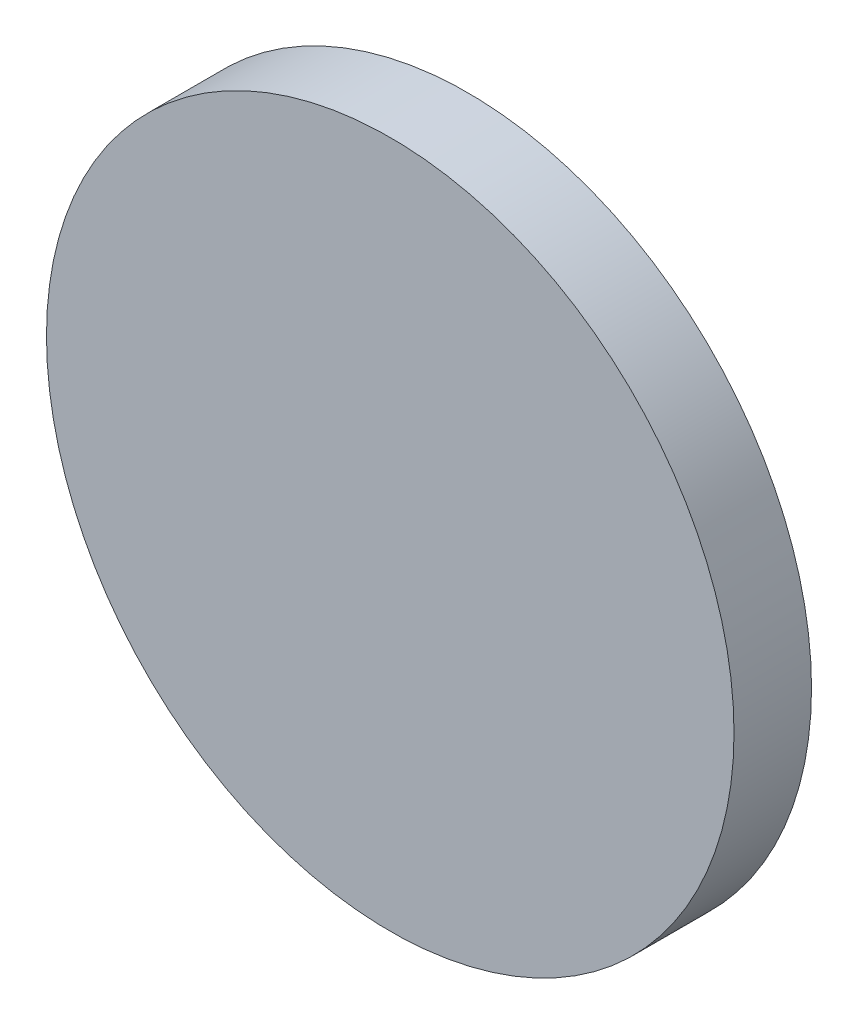
ISO-10303-21;
HEADER;
FILE_DESCRIPTION(('STEP AP214'),'2;1');
FILE_NAME('part.step','',(''),(''),'','','');
FILE_SCHEMA(('AUTOMOTIVE_DESIGN { 1 0 10303 214 1 1 1 1 }'));
ENDSEC;
DATA;
#1=APPLICATION_CONTEXT('core data for automotive mechanical design processes');
#2=APPLICATION_PROTOCOL_DEFINITION('international standard','automotive_design',2000,#1);
#3=PRODUCT_CONTEXT('',#1,'mechanical');
#4=PRODUCT('Part','Part','',(#3));
#5=PRODUCT_RELATED_PRODUCT_CATEGORY('part','',(#4));
#6=PRODUCT_DEFINITION_FORMATION('','',#4);
#7=PRODUCT_DEFINITION_CONTEXT('part definition',#1,'design');
#8=PRODUCT_DEFINITION('design','',#6,#7);
#9=PRODUCT_DEFINITION_SHAPE('','',#8);
#10=(LENGTH_UNIT() NAMED_UNIT(*) SI_UNIT(.MILLI.,.METRE.));
#11=(NAMED_UNIT(*) PLANE_ANGLE_UNIT() SI_UNIT($,.RADIAN.));
#12=(NAMED_UNIT(*) SI_UNIT($,.STERADIAN.) SOLID_ANGLE_UNIT());
#13=UNCERTAINTY_MEASURE_WITH_UNIT(LENGTH_MEASURE(1.E-05),#10,'distance_accuracy_value','');
#14=(GEOMETRIC_REPRESENTATION_CONTEXT(3) GLOBAL_UNCERTAINTY_ASSIGNED_CONTEXT((#13)) GLOBAL_UNIT_ASSIGNED_CONTEXT((#10,
#11,#12)) REPRESENTATION_CONTEXT('',''));
#15=CARTESIAN_POINT('',(0.,0.,0.));
#16=DIRECTION('',(0.,0.,1.));
#17=DIRECTION('',(1.,0.,0.));
#18=AXIS2_PLACEMENT_3D('',#15,#16,#17);
#19=CARTESIAN_POINT('',(0.,0.,6.35));
#20=DIRECTION('',(0.,0.,-1.));
#21=DIRECTION('',(-1.,0.,0.));
#22=AXIS2_PLACEMENT_3D('',#19,#20,#21);
#23=CYLINDRICAL_SURFACE('',#22,28.1625529);
#24=CARTESIAN_POINT('',(0.,0.,6.35));
#25=DIRECTION('',(0.,0.,1.));
#26=DIRECTION('',(1.,0.,0.));
#27=AXIS2_PLACEMENT_3D('',#24,#25,#26);
#28=CIRCLE('',#27,28.1625529);
#29=CARTESIAN_POINT('',(28.1625529,0.,6.35));
#30=VERTEX_POINT('',#29);
#31=EDGE_CURVE('E10',#30,#30,#28,.T.);
#32=ORIENTED_EDGE('',*,*,#31,.F.);
#33=EDGE_LOOP('',(#32));
#34=FACE_BOUND('',#33,.T.);
#35=CARTESIAN_POINT('',(0.,0.,0.));
#36=DIRECTION('',(0.,0.,1.));
#37=DIRECTION('',(1.,0.,0.));
#38=AXIS2_PLACEMENT_3D('',#35,#36,#37);
#39=CIRCLE('',#38,28.1625529);
#40=CARTESIAN_POINT('',(28.1625529,0.,0.));
#41=VERTEX_POINT('',#40);
#42=EDGE_CURVE('E40',#41,#41,#39,.T.);
#43=ORIENTED_EDGE('',*,*,#42,.T.);
#44=EDGE_LOOP('',(#43));
#45=FACE_BOUND('',#44,.T.);
#46=ADVANCED_FACE('F37',(#34,#45),#23,.T.);
#47=CARTESIAN_POINT('',(0.,0.,6.35));
#48=DIRECTION('',(0.,0.,1.));
#49=DIRECTION('',(1.,0.,0.));
#50=AXIS2_PLACEMENT_3D('',#47,#48,#49);
#51=PLANE('',#50);
#52=ORIENTED_EDGE('',*,*,#31,.T.);
#53=EDGE_LOOP('',(#52));
#54=FACE_BOUND('',#53,.T.);
#55=ADVANCED_FACE('F54',(#54),#51,.T.);
#56=CARTESIAN_POINT('',(0.,0.,0.));
#57=DIRECTION('',(0.,0.,1.));
#58=DIRECTION('',(1.,0.,0.));
#59=AXIS2_PLACEMENT_3D('',#56,#57,#58);
#60=PLANE('',#59);
#61=ORIENTED_EDGE('',*,*,#42,.F.);
#62=EDGE_LOOP('',(#61));
#63=FACE_BOUND('',#62,.T.);
#64=ADVANCED_FACE('F52',(#63),#60,.F.);
#65=CLOSED_SHELL('',(#46,#55,#64));
#66=MANIFOLD_SOLID_BREP('B2',#65);
#67=ADVANCED_BREP_SHAPE_REPRESENTATION('',(#18,#66),#14);
#68=SHAPE_DEFINITION_REPRESENTATION(#9,#67);
ENDSEC;
END-ISO-10303-21;
